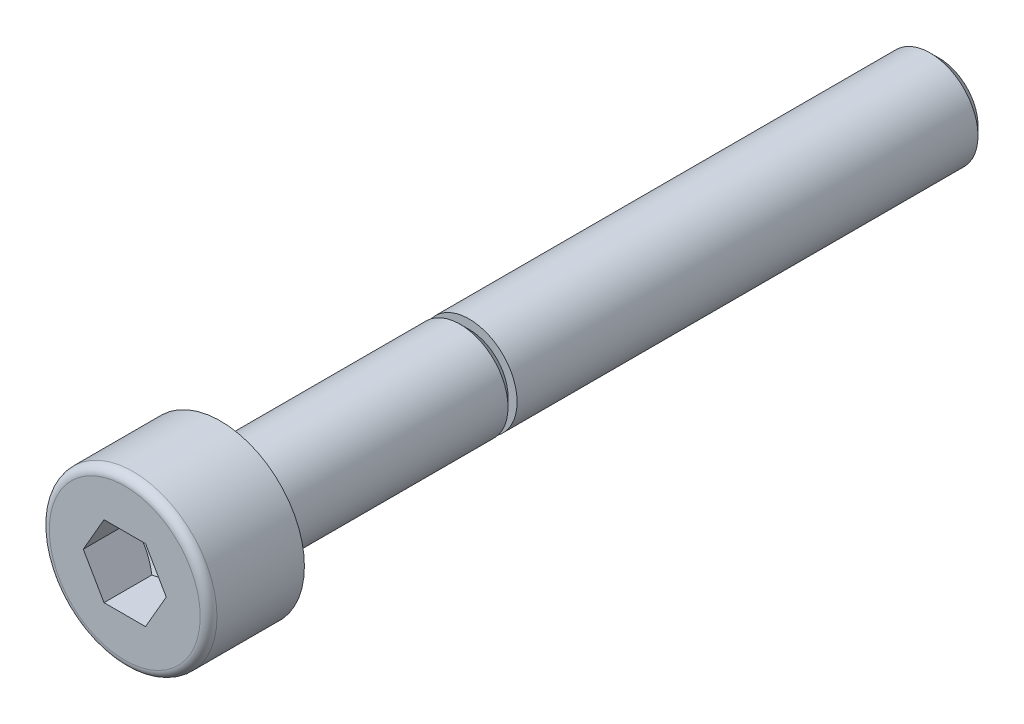
ISO-10303-21;
HEADER;
FILE_DESCRIPTION(('STEP AP214'),'2;1');
FILE_NAME('part.step','',(''),(''),'','','');
FILE_SCHEMA(('AUTOMOTIVE_DESIGN { 1 0 10303 214 1 1 1 1 }'));
ENDSEC;
DATA;
#1=APPLICATION_CONTEXT('core data for automotive mechanical design processes');
#2=APPLICATION_PROTOCOL_DEFINITION('international standard','automotive_design',2000,#1);
#3=PRODUCT_CONTEXT('',#1,'mechanical');
#4=PRODUCT('Part','Part','',(#3));
#5=PRODUCT_RELATED_PRODUCT_CATEGORY('part','',(#4));
#6=PRODUCT_DEFINITION_FORMATION('','',#4);
#7=PRODUCT_DEFINITION_CONTEXT('part definition',#1,'design');
#8=PRODUCT_DEFINITION('design','',#6,#7);
#9=PRODUCT_DEFINITION_SHAPE('','',#8);
#10=(LENGTH_UNIT() NAMED_UNIT(*) SI_UNIT(.MILLI.,.METRE.));
#11=(NAMED_UNIT(*) PLANE_ANGLE_UNIT() SI_UNIT($,.RADIAN.));
#12=(NAMED_UNIT(*) SI_UNIT($,.STERADIAN.) SOLID_ANGLE_UNIT());
#13=UNCERTAINTY_MEASURE_WITH_UNIT(LENGTH_MEASURE(1.E-05),#10,'distance_accuracy_value','');
#14=(GEOMETRIC_REPRESENTATION_CONTEXT(3) GLOBAL_UNCERTAINTY_ASSIGNED_CONTEXT((#13)) GLOBAL_UNIT_ASSIGNED_CONTEXT((#10,
#11,#12)) REPRESENTATION_CONTEXT('',''));
#15=CARTESIAN_POINT('',(0.,0.,0.));
#16=DIRECTION('',(0.,0.,1.));
#17=DIRECTION('',(1.,0.,0.));
#18=AXIS2_PLACEMENT_3D('',#15,#16,#17);
#19=CARTESIAN_POINT('',(0.,0.,4.));
#20=DIRECTION('',(0.,0.,1.));
#21=DIRECTION('',(1.,0.,0.));
#22=AXIS2_PLACEMENT_3D('',#19,#20,#21);
#23=PLANE('',#22);
#24=CARTESIAN_POINT('',(0.,0.,4.));
#25=DIRECTION('',(0.,0.,1.));
#26=DIRECTION('',(1.,0.,0.));
#27=AXIS2_PLACEMENT_3D('',#24,#25,#26);
#28=CIRCLE('',#27,3.15);
#29=CARTESIAN_POINT('',(3.15,0.,4.));
#30=VERTEX_POINT('',#29);
#31=EDGE_CURVE('E118',#30,#30,#28,.T.);
#32=ORIENTED_EDGE('',*,*,#31,.T.);
#33=EDGE_LOOP('',(#32));
#34=FACE_BOUND('',#33,.T.);
#35=DIRECTION('',(1.,0.,0.));
#36=VECTOR('',#35,1.);
#37=CARTESIAN_POINT('',(-0.866025,1.49999930062484,4.));
#38=LINE('',#37,#36);
#39=CARTESIAN_POINT('',(-0.866025,1.49999930062484,4.));
#40=VERTEX_POINT('',#39);
#41=CARTESIAN_POINT('',(0.866025,1.49999930062484,4.));
#42=VERTEX_POINT('',#41);
#43=EDGE_CURVE('E95',#40,#42,#38,.T.);
#44=ORIENTED_EDGE('',*,*,#43,.T.);
#45=DIRECTION('',(0.5,-0.866025403784438,0.));
#46=VECTOR('',#45,1.);
#47=CARTESIAN_POINT('',(0.866025,1.49999930062484,4.));
#48=LINE('',#47,#46);
#49=CARTESIAN_POINT('',(1.73205,0.,4.));
#50=VERTEX_POINT('',#49);
#51=EDGE_CURVE('E32',#42,#50,#48,.T.);
#52=ORIENTED_EDGE('',*,*,#51,.T.);
#53=DIRECTION('',(-0.5,-0.866025403784439,0.));
#54=VECTOR('',#53,1.);
#55=CARTESIAN_POINT('',(1.73205,0.,4.));
#56=LINE('',#55,#54);
#57=CARTESIAN_POINT('',(0.866025,-1.49999930062484,4.));
#58=VERTEX_POINT('',#57);
#59=EDGE_CURVE('E394',#50,#58,#56,.T.);
#60=ORIENTED_EDGE('',*,*,#59,.T.);
#61=DIRECTION('',(-1.,0.,0.));
#62=VECTOR('',#61,1.);
#63=CARTESIAN_POINT('',(0.866025,-1.49999930062484,4.));
#64=LINE('',#63,#62);
#65=CARTESIAN_POINT('',(-0.866025,-1.49999930062484,4.));
#66=VERTEX_POINT('',#65);
#67=EDGE_CURVE('E398',#58,#66,#64,.T.);
#68=ORIENTED_EDGE('',*,*,#67,.T.);
#69=DIRECTION('',(-0.5,0.866025403784439,0.));
#70=VECTOR('',#69,1.);
#71=CARTESIAN_POINT('',(-0.866025,-1.49999930062484,4.));
#72=LINE('',#71,#70);
#73=CARTESIAN_POINT('',(-1.73205,0.,4.));
#74=VERTEX_POINT('',#73);
#75=EDGE_CURVE('E403',#66,#74,#72,.T.);
#76=ORIENTED_EDGE('',*,*,#75,.T.);
#77=DIRECTION('',(0.5,0.866025403784439,0.));
#78=VECTOR('',#77,1.);
#79=CARTESIAN_POINT('',(-1.73205,0.,4.));
#80=LINE('',#79,#78);
#81=EDGE_CURVE('E104',#74,#40,#80,.T.);
#82=ORIENTED_EDGE('',*,*,#81,.T.);
#83=EDGE_LOOP('',(#44,#52,#60,#68,#76,#82));
#84=FACE_BOUND('',#83,.T.);
#85=ADVANCED_FACE('F16',(#34,#84),#23,.T.);
#86=CARTESIAN_POINT('',(0.,1.621125,-30.));
#87=DIRECTION('',(0.,0.,-1.));
#88=DIRECTION('',(-1.,0.,0.));
#89=AXIS2_PLACEMENT_3D('',#86,#87,#88);
#90=PLANE('',#89);
#91=CARTESIAN_POINT('',(0.,0.,-30.));
#92=DIRECTION('',(0.,0.,1.));
#93=DIRECTION('',(1.,0.,0.));
#94=AXIS2_PLACEMENT_3D('',#91,#92,#93);
#95=CIRCLE('',#94,1.621125);
#96=CARTESIAN_POINT('',(1.621125,0.,-30.));
#97=VERTEX_POINT('',#96);
#98=EDGE_CURVE('E11',#97,#97,#95,.T.);
#99=ORIENTED_EDGE('',*,*,#98,.F.);
#100=EDGE_LOOP('',(#99));
#101=FACE_BOUND('',#100,.T.);
#102=ADVANCED_FACE('F18',(#101),#90,.T.);
#103=CARTESIAN_POINT('',(0.,0.,-29.621125));
#104=DIRECTION('',(0.,0.,1.));
#105=DIRECTION('',(1.,0.,0.));
#106=AXIS2_PLACEMENT_3D('',#103,#104,#105);
#107=CONICAL_SURFACE('',#106,2.,0.785398163397448);
#108=ORIENTED_EDGE('',*,*,#98,.T.);
#109=EDGE_LOOP('',(#108));
#110=FACE_BOUND('',#109,.T.);
#111=CARTESIAN_POINT('',(0.,0.,-29.621125));
#112=DIRECTION('',(0.,0.,1.));
#113=DIRECTION('',(1.,0.,0.));
#114=AXIS2_PLACEMENT_3D('',#111,#112,#113);
#115=CIRCLE('',#114,2.);
#116=CARTESIAN_POINT('',(2.,0.,-29.621125));
#117=VERTEX_POINT('',#116);
#118=EDGE_CURVE('E25',#117,#117,#115,.T.);
#119=ORIENTED_EDGE('',*,*,#118,.F.);
#120=EDGE_LOOP('',(#119));
#121=FACE_BOUND('',#120,.T.);
#122=ADVANCED_FACE('F159',(#110,#121),#107,.T.);
#123=CARTESIAN_POINT('',(0.,0.,4.));
#124=DIRECTION('',(0.,0.,1.));
#125=DIRECTION('',(1.,0.,0.));
#126=AXIS2_PLACEMENT_3D('',#123,#124,#125);
#127=CYLINDRICAL_SURFACE('',#126,2.);
#128=ORIENTED_EDGE('',*,*,#118,.T.);
#129=EDGE_LOOP('',(#128));
#130=FACE_BOUND('',#129,.T.);
#131=CARTESIAN_POINT('',(0.,0.,-10.378875));
#132=DIRECTION('',(0.,0.,1.));
#133=DIRECTION('',(1.,0.,0.));
#134=AXIS2_PLACEMENT_3D('',#131,#132,#133);
#135=CIRCLE('',#134,2.);
#136=CARTESIAN_POINT('',(2.,0.,-10.378875));
#137=VERTEX_POINT('',#136);
#138=EDGE_CURVE('E146',#137,#137,#135,.T.);
#139=ORIENTED_EDGE('',*,*,#138,.F.);
#140=EDGE_LOOP('',(#139));
#141=FACE_BOUND('',#140,.T.);
#142=ADVANCED_FACE('F156',(#130,#141),#127,.T.);
#143=CARTESIAN_POINT('',(0.,1.621125,-10.378875));
#144=DIRECTION('',(0.,0.,1.));
#145=DIRECTION('',(1.,0.,0.));
#146=AXIS2_PLACEMENT_3D('',#143,#144,#145);
#147=PLANE('',#146);
#148=ORIENTED_EDGE('',*,*,#138,.T.);
#149=EDGE_LOOP('',(#148));
#150=FACE_BOUND('',#149,.T.);
#151=CARTESIAN_POINT('',(0.,0.,-10.378875));
#152=DIRECTION('',(0.,0.,1.));
#153=DIRECTION('',(1.,0.,0.));
#154=AXIS2_PLACEMENT_3D('',#151,#152,#153);
#155=CIRCLE('',#154,1.621125);
#156=CARTESIAN_POINT('',(1.621125,0.,-10.378875));
#157=VERTEX_POINT('',#156);
#158=EDGE_CURVE('E142',#157,#157,#155,.T.);
#159=ORIENTED_EDGE('',*,*,#158,.F.);
#160=EDGE_LOOP('',(#159));
#161=FACE_BOUND('',#160,.T.);
#162=ADVANCED_FACE('F167',(#150,#161),#147,.T.);
#163=CARTESIAN_POINT('',(0.,0.,-10.));
#164=DIRECTION('',(0.,0.,1.));
#165=DIRECTION('',(1.,0.,0.));
#166=AXIS2_PLACEMENT_3D('',#163,#164,#165);
#167=CONICAL_SURFACE('',#166,2.,0.785398163397448);
#168=ORIENTED_EDGE('',*,*,#158,.T.);
#169=EDGE_LOOP('',(#168));
#170=FACE_BOUND('',#169,.T.);
#171=CARTESIAN_POINT('',(0.,0.,-10.));
#172=DIRECTION('',(0.,0.,1.));
#173=DIRECTION('',(1.,0.,0.));
#174=AXIS2_PLACEMENT_3D('',#171,#172,#173);
#175=CIRCLE('',#174,2.);
#176=CARTESIAN_POINT('',(2.,0.,-10.));
#177=VERTEX_POINT('',#176);
#178=EDGE_CURVE('E138',#177,#177,#175,.T.);
#179=ORIENTED_EDGE('',*,*,#178,.F.);
#180=EDGE_LOOP('',(#179));
#181=FACE_BOUND('',#180,.T.);
#182=ADVANCED_FACE('F199',(#170,#181),#167,.T.);
#183=CARTESIAN_POINT('',(0.,0.,4.));
#184=DIRECTION('',(0.,0.,1.));
#185=DIRECTION('',(1.,0.,0.));
#186=AXIS2_PLACEMENT_3D('',#183,#184,#185);
#187=CYLINDRICAL_SURFACE('',#186,2.);
#188=ORIENTED_EDGE('',*,*,#178,.T.);
#189=EDGE_LOOP('',(#188));
#190=FACE_BOUND('',#189,.T.);
#191=CARTESIAN_POINT('',(0.,0.,-0.2));
#192=DIRECTION('',(0.,0.,1.));
#193=DIRECTION('',(1.,0.,0.));
#194=AXIS2_PLACEMENT_3D('',#191,#192,#193);
#195=CIRCLE('',#194,2.);
#196=CARTESIAN_POINT('',(2.,0.,-0.2));
#197=VERTEX_POINT('',#196);
#198=EDGE_CURVE('E134',#197,#197,#195,.T.);
#199=ORIENTED_EDGE('',*,*,#198,.F.);
#200=EDGE_LOOP('',(#199));
#201=FACE_BOUND('',#200,.T.);
#202=ADVANCED_FACE('F195',(#190,#201),#187,.T.);
#203=CARTESIAN_POINT('',(0.,0.,-0.2));
#204=DIRECTION('',(0.,0.,1.));
#205=DIRECTION('',(1.,0.,0.));
#206=AXIS2_PLACEMENT_3D('',#203,#204,#205);
#207=TOROIDAL_SURFACE('',#206,2.2,0.2);
#208=ORIENTED_EDGE('',*,*,#198,.T.);
#209=EDGE_LOOP('',(#208));
#210=FACE_BOUND('',#209,.T.);
#211=CARTESIAN_POINT('',(0.,0.,0.));
#212=DIRECTION('',(0.,0.,1.));
#213=DIRECTION('',(1.,0.,0.));
#214=AXIS2_PLACEMENT_3D('',#211,#212,#213);
#215=CIRCLE('',#214,2.2);
#216=CARTESIAN_POINT('',(2.2,0.,0.));
#217=VERTEX_POINT('',#216);
#218=EDGE_CURVE('E130',#217,#217,#215,.T.);
#219=ORIENTED_EDGE('',*,*,#218,.F.);
#220=EDGE_LOOP('',(#219));
#221=FACE_BOUND('',#220,.T.);
#222=ADVANCED_FACE('F191',(#210,#221),#207,.F.);
#223=CARTESIAN_POINT('',(0.,3.5,0.));
#224=DIRECTION('',(0.,0.,-1.));
#225=DIRECTION('',(-1.,0.,0.));
#226=AXIS2_PLACEMENT_3D('',#223,#224,#225);
#227=PLANE('',#226);
#228=ORIENTED_EDGE('',*,*,#218,.T.);
#229=EDGE_LOOP('',(#228));
#230=FACE_BOUND('',#229,.T.);
#231=CARTESIAN_POINT('',(0.,0.,0.));
#232=DIRECTION('',(0.,0.,1.));
#233=DIRECTION('',(1.,0.,0.));
#234=AXIS2_PLACEMENT_3D('',#231,#232,#233);
#235=CIRCLE('',#234,3.5);
#236=CARTESIAN_POINT('',(3.5,0.,0.));
#237=VERTEX_POINT('',#236);
#238=EDGE_CURVE('E126',#237,#237,#235,.T.);
#239=ORIENTED_EDGE('',*,*,#238,.F.);
#240=EDGE_LOOP('',(#239));
#241=FACE_BOUND('',#240,.T.);
#242=ADVANCED_FACE('F187',(#230,#241),#227,.T.);
#243=CARTESIAN_POINT('',(0.,0.,4.));
#244=DIRECTION('',(0.,0.,1.));
#245=DIRECTION('',(1.,0.,0.));
#246=AXIS2_PLACEMENT_3D('',#243,#244,#245);
#247=CYLINDRICAL_SURFACE('',#246,3.5);
#248=ORIENTED_EDGE('',*,*,#238,.T.);
#249=EDGE_LOOP('',(#248));
#250=FACE_BOUND('',#249,.T.);
#251=CARTESIAN_POINT('',(0.,0.,3.65));
#252=DIRECTION('',(0.,0.,1.));
#253=DIRECTION('',(1.,0.,0.));
#254=AXIS2_PLACEMENT_3D('',#251,#252,#253);
#255=CIRCLE('',#254,3.5);
#256=CARTESIAN_POINT('',(3.5,0.,3.65));
#257=VERTEX_POINT('',#256);
#258=EDGE_CURVE('E122',#257,#257,#255,.T.);
#259=ORIENTED_EDGE('',*,*,#258,.F.);
#260=EDGE_LOOP('',(#259));
#261=FACE_BOUND('',#260,.T.);
#262=ADVANCED_FACE('F183',(#250,#261),#247,.T.);
#263=CARTESIAN_POINT('',(0.,0.,3.65));
#264=DIRECTION('',(0.,0.,1.));
#265=DIRECTION('',(1.,0.,0.));
#266=AXIS2_PLACEMENT_3D('',#263,#264,#265);
#267=TOROIDAL_SURFACE('',#266,3.15,0.35);
#268=ORIENTED_EDGE('',*,*,#31,.F.);
#269=EDGE_LOOP('',(#268));
#270=FACE_BOUND('',#269,.T.);
#271=ORIENTED_EDGE('',*,*,#258,.T.);
#272=EDGE_LOOP('',(#271));
#273=FACE_BOUND('',#272,.T.);
#274=ADVANCED_FACE('F180',(#270,#273),#267,.T.);
#275=CARTESIAN_POINT('',(0.866025,1.49999930062484,1.00000046625011));
#276=DIRECTION('',(-0.866025403784438,-0.5,0.));
#277=DIRECTION('',(-0.5,0.866025403784438,0.));
#278=AXIS2_PLACEMENT_3D('',#275,#276,#277);
#279=PLANE('',#278);
#280=DIRECTION('',(0.,0.,1.));
#281=VECTOR('',#280,1.);
#282=CARTESIAN_POINT('',(1.73205,0.,1.00000046625011));
#283=LINE('',#282,#281);
#284=CARTESIAN_POINT('',(1.73205,0.,2.));
#285=VERTEX_POINT('',#284);
#286=EDGE_CURVE('E116',#285,#50,#283,.T.);
#287=ORIENTED_EDGE('',*,*,#286,.T.);
#288=ORIENTED_EDGE('',*,*,#51,.F.);
#289=DIRECTION('',(0.,0.,1.));
#290=VECTOR('',#289,1.);
#291=CARTESIAN_POINT('',(0.866025,1.49999930062484,1.00000046625011));
#292=LINE('',#291,#290);
#293=CARTESIAN_POINT('',(0.866025,1.49999930062484,2.));
#294=VERTEX_POINT('',#293);
#295=EDGE_CURVE('E88',#294,#42,#292,.T.);
#296=ORIENTED_EDGE('',*,*,#295,.F.);
#297=CARTESIAN_POINT('',(1.73205115470054,-2.E-06,2.00000066666734));
#298=CARTESIAN_POINT('',(1.69399458130122,0.0659139186895892,1.97802228100261));
#299=CARTESIAN_POINT('',(1.65560950414464,0.132398822577242,1.95803408114054));
#300=CARTESIAN_POINT('',(1.57817473630843,0.266519774741864,1.92314525941874));
#301=CARTESIAN_POINT('',(1.53912367019894,0.334158205333232,1.90825697858766));
#302=CARTESIAN_POINT('',(1.46150547885139,0.468596856338784,1.88508226983918));
#303=CARTESIAN_POINT('',(1.42295029290091,0.535376397300293,1.87664158385231));
#304=CARTESIAN_POINT('',(1.34565859846878,0.669249539059823,1.86656700525616));
#305=CARTESIAN_POINT('',(1.30692237073331,0.736342653591208,1.86492476807133));
#306=CARTESIAN_POINT('',(1.23454773253413,0.861699204131607,1.86834969801067));
#307=CARTESIAN_POINT('',(1.20089846229767,0.919981449818777,1.87257593125167));
#308=CARTESIAN_POINT('',(1.1338191361032,1.03616625092508,1.88596796669928));
#309=CARTESIAN_POINT('',(1.10038931198579,1.09406840478452,1.89513833923059));
#310=CARTESIAN_POINT('',(1.03317179328088,1.21049256234014,1.91806252128818));
#311=CARTESIAN_POINT('',(0.999392601793287,1.26899983823525,1.93191346069662));
#312=CARTESIAN_POINT('',(0.932337893068965,1.38514200063251,1.96334924731355));
#313=CARTESIAN_POINT('',(0.89906151743008,1.4427783739308,1.980926712986));
#314=CARTESIAN_POINT('',(0.866023845299461,1.50000130062484,2.00000066666734));
#315=B_SPLINE_CURVE_WITH_KNOTS('',3,(#297,#298,#299,#300,#301,#302,#303,#304,#305,#306,#307,
#308,#309,#310,#311,#312,#313,#314),.UNSPECIFIED.,.F.,.F.,(4,2,2,2,2,2,2,2,4),(0.,
0.237762055931485,0.476095461361748,0.708530837844131,0.94068083294838,1.14278193102308,
1.34507017093339,1.55184422617205,1.75821246569164),.UNSPECIFIED.);
#316=EDGE_CURVE('E80',#285,#294,#315,.T.);
#317=ORIENTED_EDGE('',*,*,#316,.F.);
#318=EDGE_LOOP('',(#287,#288,#296,#317));
#319=FACE_BOUND('',#318,.T.);
#320=ADVANCED_FACE('F89',(#319),#279,.T.);
#321=CARTESIAN_POINT('',(1.73205,0.,1.00000046625011));
#322=DIRECTION('',(-0.866025403784439,0.5,0.));
#323=DIRECTION('',(0.5,0.866025403784439,0.));
#324=AXIS2_PLACEMENT_3D('',#321,#322,#323);
#325=PLANE('',#324);
#326=DIRECTION('',(0.,0.,1.));
#327=VECTOR('',#326,1.);
#328=CARTESIAN_POINT('',(0.866025,-1.49999930062484,1.00000046625011));
#329=LINE('',#328,#327);
#330=CARTESIAN_POINT('',(0.866025,-1.49999930062484,2.));
#331=VERTEX_POINT('',#330);
#332=EDGE_CURVE('E113',#331,#58,#329,.T.);
#333=ORIENTED_EDGE('',*,*,#332,.T.);
#334=ORIENTED_EDGE('',*,*,#59,.F.);
#335=ORIENTED_EDGE('',*,*,#286,.F.);
#336=CARTESIAN_POINT('',(0.866023845299462,-1.50000130062484,2.00000066666734));
#337=CARTESIAN_POINT('',(0.904080418698778,-1.43408538193525,1.9780222810026));
#338=CARTESIAN_POINT('',(0.942465495855361,-1.36760047804759,1.95803408114054));
#339=CARTESIAN_POINT('',(1.01990026369157,-1.23347952588297,1.92314525941874));
#340=CARTESIAN_POINT('',(1.05895132980106,-1.1658410952916,1.90825697858766));
#341=CARTESIAN_POINT('',(1.13656952114861,-1.03140244428605,1.88508226983918));
#342=CARTESIAN_POINT('',(1.1751247070991,-0.964622903324544,1.87664158385231));
#343=CARTESIAN_POINT('',(1.25241640153122,-0.830749761565014,1.86656700525616));
#344=CARTESIAN_POINT('',(1.29115262926669,-0.763656647033629,1.86492476807133));
#345=CARTESIAN_POINT('',(1.36352726746587,-0.638300096493229,1.86834969801067));
#346=CARTESIAN_POINT('',(1.39717653770233,-0.58001785080606,1.87257593125166));
#347=CARTESIAN_POINT('',(1.4642558638968,-0.463833049699756,1.88596796669928));
#348=CARTESIAN_POINT('',(1.49768568801421,-0.405930895840313,1.89513833923059));
#349=CARTESIAN_POINT('',(1.56490320671912,-0.2895067382847,1.91806252128818));
#350=CARTESIAN_POINT('',(1.59868239820671,-0.230999462389588,1.93191346069662));
#351=CARTESIAN_POINT('',(1.66573710693103,-0.11485729999233,1.96334924731355));
#352=CARTESIAN_POINT('',(1.69901348256992,-0.0572209266940348,1.980926712986));
#353=CARTESIAN_POINT('',(1.73205115470054,1.99999999979098E-06,2.00000066666734));
#354=B_SPLINE_CURVE_WITH_KNOTS('',3,(#336,#337,#338,#339,#340,#341,#342,#343,#344,#345,#346,
#347,#348,#349,#350,#351,#352,#353),.UNSPECIFIED.,.F.,.F.,(4,2,2,2,2,2,2,2,4),(0.,
0.237762055931484,0.476095461361747,0.708530837844129,0.940680832948377,1.14278193102307,
1.34507017093338,1.55184422617205,1.75821246569164),.UNSPECIFIED.);
#355=EDGE_CURVE('E84',#331,#285,#354,.T.);
#356=ORIENTED_EDGE('',*,*,#355,.F.);
#357=EDGE_LOOP('',(#333,#334,#335,#356));
#358=FACE_BOUND('',#357,.T.);
#359=ADVANCED_FACE('F256',(#358),#325,.T.);
#360=CARTESIAN_POINT('',(0.866025,-1.49999930062484,1.00000046625011));
#361=DIRECTION('',(0.,1.,0.));
#362=DIRECTION('',(1.,0.,0.));
#363=AXIS2_PLACEMENT_3D('',#360,#361,#362);
#364=PLANE('',#363);
#365=DIRECTION('',(0.,0.,1.));
#366=VECTOR('',#365,1.);
#367=CARTESIAN_POINT('',(-0.866025,-1.49999930062484,1.00000046625011));
#368=LINE('',#367,#366);
#369=CARTESIAN_POINT('',(-0.866025,-1.49999930062484,2.));
#370=VERTEX_POINT('',#369);
#371=EDGE_CURVE('E110',#370,#66,#368,.T.);
#372=ORIENTED_EDGE('',*,*,#371,.T.);
#373=ORIENTED_EDGE('',*,*,#67,.F.);
#374=ORIENTED_EDGE('',*,*,#332,.F.);
#375=CARTESIAN_POINT('',(-2.24271663728987,-1.49999930062484,2.55775267344395));
#376=CARTESIAN_POINT('',(-2.17794141332338,-1.49999930062484,2.52667596135368));
#377=CARTESIAN_POINT('',(-2.11300852130655,-1.49999930062484,2.49592211621229));
#378=CARTESIAN_POINT('',(-1.98274303131292,-1.49999930062484,2.43524311162405));
#379=CARTESIAN_POINT('',(-1.91741036395219,-1.49999930062484,2.40531810131238));
#380=CARTESIAN_POINT('',(-1.78588635397686,-1.49999930062484,2.34631254095844));
#381=CARTESIAN_POINT('',(-1.71969220663993,-1.49999930062484,2.31723821458641));
#382=CARTESIAN_POINT('',(-1.58674953026847,-1.49999930062484,2.26039396688304));
#383=CARTESIAN_POINT('',(-1.52000103027226,-1.49999930062484,2.23262397772829));
#384=CARTESIAN_POINT('',(-1.38408036083489,-1.49999930062484,2.17802545642731));
#385=CARTESIAN_POINT('',(-1.31489044686774,-1.49999930062484,2.1512405113674));
#386=CARTESIAN_POINT('',(-1.17568875836751,-1.49999930062484,2.09990652822181));
#387=CARTESIAN_POINT('',(-1.10567688208708,-1.49999930062484,2.07535777031023));
#388=CARTESIAN_POINT('',(-0.894522216300188,-1.49999930062484,2.0061010834001));
#389=CARTESIAN_POINT('',(-0.751873977094198,-1.49999930062484,1.9656202744164));
#390=CARTESIAN_POINT('',(-0.535047450977606,-1.49999930062484,1.9186645261203));
#391=CARTESIAN_POINT('',(-0.462365424606466,-1.49999930062484,1.90531291688069));
#392=CARTESIAN_POINT('',(-0.316183762847225,-1.49999930062484,1.8841134767258));
#393=CARTESIAN_POINT('',(-0.242684183051902,-1.49999930062484,1.87626527388084));
#394=CARTESIAN_POINT('',(-0.0961588910059515,-1.49999930062484,1.86679859934064));
#395=CARTESIAN_POINT('',(-0.0231380525234333,-1.49999930062484,1.86510661239957));
#396=CARTESIAN_POINT('',(0.122783022434076,-1.49999930062484,1.86789948707645));
#397=CARTESIAN_POINT('',(0.195683251161583,-1.49999930062484,1.8723847311637));
#398=CARTESIAN_POINT('',(0.375553746438775,-1.49999930062484,1.89067768491976));
#399=CARTESIAN_POINT('',(0.4821754471692,-1.49999930062484,1.90791354190592));
#400=CARTESIAN_POINT('',(0.693345462539466,-1.49999930062484,1.95235984396466));
#401=CARTESIAN_POINT('',(0.79789111749796,-1.49999930062484,1.97958231080908));
#402=CARTESIAN_POINT('',(0.954250638010105,-1.49999930062484,2.02608493590371));
#403=CARTESIAN_POINT('',(1.00687274480645,-1.49999930062484,2.04274751774646));
#404=CARTESIAN_POINT('',(1.11156919647057,-1.49999930062484,2.07761406562061));
#405=CARTESIAN_POINT('',(1.16364386068557,-1.49999930062484,2.09581706970924));
#406=CARTESIAN_POINT('',(1.26731501755411,-1.49999930062484,2.13350010092581));
#407=CARTESIAN_POINT('',(1.31891159517315,-1.49999930062484,2.15297989597396));
#408=CARTESIAN_POINT('',(1.42169818698628,-1.49999930062484,2.19300580386973));
#409=CARTESIAN_POINT('',(1.47288813079445,-1.49999930062484,2.21355209687612));
#410=CARTESIAN_POINT('',(1.6035520536722,-1.49999930062484,2.26731329701247));
#411=CARTESIAN_POINT('',(1.68276476914258,-1.49999930062484,2.30116251352867));
#412=CARTESIAN_POINT('',(1.84047488481565,-1.49999930062484,2.37049266735));
#413=CARTESIAN_POINT('',(1.9189722309026,-1.49999930062484,2.40597372689195));
#414=CARTESIAN_POINT('',(2.15362957255391,-1.49999930062484,2.51428942992019));
#415=CARTESIAN_POINT('',(2.3089286607519,-1.49999930062484,2.58898549353906));
#416=CARTESIAN_POINT('',(2.61820006623532,-1.49999930062484,2.74151036059574));
#417=CARTESIAN_POINT('',(2.77217051778771,-1.49999930062484,2.81934290231597));
#418=CARTESIAN_POINT('',(3.07905650209162,-1.49999930062484,2.97700931547993));
#419=CARTESIAN_POINT('',(3.23197216581148,-1.49999930062484,3.05684293253984));
#420=CARTESIAN_POINT('',(3.52267476728495,-1.49999930062484,3.21028853935711));
#421=CARTESIAN_POINT('',(3.66052737206612,-1.49999930062484,3.28377655462836));
#422=CARTESIAN_POINT('',(3.93578914881928,-1.49999930062484,3.43158990958268));
#423=CARTESIAN_POINT('',(4.07319830413762,-1.49999930062484,3.50591528025237));
#424=CARTESIAN_POINT('',(4.34732590427536,-1.49999930062483,3.65500351537988));
#425=CARTESIAN_POINT('',(4.48404521696312,-1.49999930062483,3.72976478622522));
#426=CARTESIAN_POINT('',(4.75720742747683,-1.49999930062483,3.87977391809883));
#427=CARTESIAN_POINT('',(4.89365033939364,-1.49999930062484,3.9550217534582));
#428=CARTESIAN_POINT('',(5.02999394665514,-1.49999930062484,4.03044801324502));
#429=B_SPLINE_CURVE_WITH_KNOTS('',3,(#375,#376,#377,#378,#379,#380,#381,#382,#383,#384,#385,
#386,#387,#388,#389,#390,#391,#392,#393,#394,#395,#396,#397,#398,#399,#400,#401,#402,#403,#404,
#405,#406,#407,#408,#409,#410,#411,#412,#413,#414,#415,#416,#417,#418,#419,#420,#421,#422,#423,
#424,#425,#426,#427,#428),.UNSPECIFIED.,.F.,.F.,(4,2,2,2,2,2,2,2,2,2,2,2,2,2,2,2,2,2,2,2,2,2,2,
2,2,2,4),(0.,0.215535408976475,0.431109351318747,0.647990972858705,0.864861304394723,
1.08740082372431,1.30996818700982,1.75384735851117,1.97537373294937,2.19688513480997,
2.41574248382684,2.63461338422016,2.95796620171825,3.28170955197757,3.44728283297626,
3.61275347131505,3.77819411534645,3.94366279806486,4.20206179692704,4.46048018336434,
4.97740230798824,5.49495989978084,6.01245202818902,6.48110050133562,6.94976637432356,
7.41724019162004,7.88468954517039),.UNSPECIFIED.);
#430=EDGE_CURVE('E440',#370,#331,#429,.T.);
#431=ORIENTED_EDGE('',*,*,#430,.F.);
#432=EDGE_LOOP('',(#372,#373,#374,#431));
#433=FACE_BOUND('',#432,.T.);
#434=ADVANCED_FACE('F262',(#433),#364,.T.);
#435=CARTESIAN_POINT('',(-0.866025,-1.49999930062484,1.00000046625011));
#436=DIRECTION('',(0.866025403784439,0.5,0.));
#437=DIRECTION('',(0.5,-0.866025403784439,0.));
#438=AXIS2_PLACEMENT_3D('',#435,#436,#437);
#439=PLANE('',#438);
#440=DIRECTION('',(0.,0.,1.));
#441=VECTOR('',#440,1.);
#442=CARTESIAN_POINT('',(-1.73205,0.,1.00000046625011));
#443=LINE('',#442,#441);
#444=CARTESIAN_POINT('',(-1.73205,0.,2.));
#445=VERTEX_POINT('',#444);
#446=EDGE_CURVE('E101',#445,#74,#443,.T.);
#447=ORIENTED_EDGE('',*,*,#446,.T.);
#448=ORIENTED_EDGE('',*,*,#75,.F.);
#449=ORIENTED_EDGE('',*,*,#371,.F.);
#450=CARTESIAN_POINT('',(-1.73205115470054,1.99999999935948E-06,2.00000066666734));
#451=CARTESIAN_POINT('',(-1.69399458130122,-0.0659139186895897,1.97802228100261));
#452=CARTESIAN_POINT('',(-1.65560950414464,-0.132398822577242,1.95803408114054));
#453=CARTESIAN_POINT('',(-1.57817473630843,-0.266519774741865,1.92314525941874));
#454=CARTESIAN_POINT('',(-1.53912367019894,-0.334158205333233,1.90825697858766));
#455=CARTESIAN_POINT('',(-1.46150547885139,-0.468596856338785,1.88508226983918));
#456=CARTESIAN_POINT('',(-1.4229502929009,-0.535376397300293,1.87664158385231));
#457=CARTESIAN_POINT('',(-1.34565859846878,-0.669249539059823,1.86656700525616));
#458=CARTESIAN_POINT('',(-1.30692237073331,-0.736342653591209,1.86492476807133));
#459=CARTESIAN_POINT('',(-1.23454773253413,-0.861699204131608,1.86834969801067));
#460=CARTESIAN_POINT('',(-1.20089846229767,-0.919981449818777,1.87257593125166));
#461=CARTESIAN_POINT('',(-1.1338191361032,-1.03616625092508,1.88596796669928));
#462=CARTESIAN_POINT('',(-1.10038931198579,-1.09406840478452,1.89513833923059));
#463=CARTESIAN_POINT('',(-1.03317179328088,-1.21049256234014,1.91806252128818));
#464=CARTESIAN_POINT('',(-0.999392601793289,-1.26899983823525,1.93191346069662));
#465=CARTESIAN_POINT('',(-0.932337893068967,-1.38514200063251,1.96334924731355));
#466=CARTESIAN_POINT('',(-0.899061517430081,-1.4427783739308,1.980926712986));
#467=CARTESIAN_POINT('',(-0.866023845299461,-1.50000130062484,2.00000066666734));
#468=B_SPLINE_CURVE_WITH_KNOTS('',3,(#450,#451,#452,#453,#454,#455,#456,#457,#458,#459,#460,
#461,#462,#463,#464,#465,#466,#467),.UNSPECIFIED.,.F.,.F.,(4,2,2,2,2,2,2,2,4),(0.,
0.237762055931485,0.476095461361749,0.708530837844132,0.94068083294838,1.14278193102308,
1.34507017093338,1.55184422617205,1.75821246569164),.UNSPECIFIED.);
#469=EDGE_CURVE('E436',#445,#370,#468,.T.);
#470=ORIENTED_EDGE('',*,*,#469,.F.);
#471=EDGE_LOOP('',(#447,#448,#449,#470));
#472=FACE_BOUND('',#471,.T.);
#473=ADVANCED_FACE('F269',(#472),#439,.T.);
#474=CARTESIAN_POINT('',(-1.73205,0.,1.00000046625011));
#475=DIRECTION('',(0.866025403784439,-0.5,0.));
#476=DIRECTION('',(-0.5,-0.866025403784439,0.));
#477=AXIS2_PLACEMENT_3D('',#474,#475,#476);
#478=PLANE('',#477);
#479=DIRECTION('',(0.,0.,1.));
#480=VECTOR('',#479,1.);
#481=CARTESIAN_POINT('',(-0.866025,1.49999930062484,1.00000046625011));
#482=LINE('',#481,#480);
#483=CARTESIAN_POINT('',(-0.866025,1.49999930062484,2.));
#484=VERTEX_POINT('',#483);
#485=EDGE_CURVE('E94',#484,#40,#482,.T.);
#486=ORIENTED_EDGE('',*,*,#485,.T.);
#487=ORIENTED_EDGE('',*,*,#81,.F.);
#488=ORIENTED_EDGE('',*,*,#446,.F.);
#489=CARTESIAN_POINT('',(-0.866023845299462,1.50000130062484,2.00000066666734));
#490=CARTESIAN_POINT('',(-0.904080418698778,1.43408538193525,1.9780222810026));
#491=CARTESIAN_POINT('',(-0.942465495855361,1.36760047804759,1.95803408114054));
#492=CARTESIAN_POINT('',(-1.01990026369157,1.23347952588297,1.92314525941874));
#493=CARTESIAN_POINT('',(-1.05895132980106,1.1658410952916,1.90825697858766));
#494=CARTESIAN_POINT('',(-1.13656952114861,1.03140244428605,1.88508226983918));
#495=CARTESIAN_POINT('',(-1.1751247070991,0.964622903324544,1.87664158385231));
#496=CARTESIAN_POINT('',(-1.25241640153122,0.830749761565014,1.86656700525616));
#497=CARTESIAN_POINT('',(-1.29115262926669,0.763656647033629,1.86492476807133));
#498=CARTESIAN_POINT('',(-1.36352726746587,0.638300096493229,1.86834969801067));
#499=CARTESIAN_POINT('',(-1.39717653770233,0.58001785080606,1.87257593125166));
#500=CARTESIAN_POINT('',(-1.4642558638968,0.463833049699756,1.88596796669928));
#501=CARTESIAN_POINT('',(-1.49768568801421,0.405930895840313,1.89513833923059));
#502=CARTESIAN_POINT('',(-1.56490320671912,0.289506738284699,1.91806252128818));
#503=CARTESIAN_POINT('',(-1.59868239820671,0.230999462389588,1.93191346069662));
#504=CARTESIAN_POINT('',(-1.66573710693103,0.11485729999233,1.96334924731355));
#505=CARTESIAN_POINT('',(-1.69901348256992,0.0572209266940344,1.980926712986));
#506=CARTESIAN_POINT('',(-1.73205115470054,-2.00000000048508E-06,2.00000066666734));
#507=B_SPLINE_CURVE_WITH_KNOTS('',3,(#489,#490,#491,#492,#493,#494,#495,#496,#497,#498,#499,
#500,#501,#502,#503,#504,#505,#506),.UNSPECIFIED.,.F.,.F.,(4,2,2,2,2,2,2,2,4),(0.,
0.237762055931484,0.476095461361747,0.708530837844129,0.940680832948377,1.14278193102307,
1.34507017093338,1.55184422617205,1.75821246569164),.UNSPECIFIED.);
#508=EDGE_CURVE('E40',#484,#445,#507,.T.);
#509=ORIENTED_EDGE('',*,*,#508,.F.);
#510=EDGE_LOOP('',(#486,#487,#488,#509));
#511=FACE_BOUND('',#510,.T.);
#512=ADVANCED_FACE('F277',(#511),#478,.T.);
#513=CARTESIAN_POINT('',(-0.866025,1.49999930062484,1.00000046625011));
#514=DIRECTION('',(0.,-1.,0.));
#515=DIRECTION('',(-1.,0.,0.));
#516=AXIS2_PLACEMENT_3D('',#513,#514,#515);
#517=PLANE('',#516);
#518=ORIENTED_EDGE('',*,*,#295,.T.);
#519=ORIENTED_EDGE('',*,*,#43,.F.);
#520=ORIENTED_EDGE('',*,*,#485,.F.);
#521=CARTESIAN_POINT('',(-2.24271663728987,1.49999930062484,2.55775267344395));
#522=CARTESIAN_POINT('',(-2.17794141332338,1.49999930062484,2.52667596135368));
#523=CARTESIAN_POINT('',(-2.11300852130655,1.49999930062484,2.49592211621229));
#524=CARTESIAN_POINT('',(-1.98274303131292,1.49999930062484,2.43524311162405));
#525=CARTESIAN_POINT('',(-1.91741036395219,1.49999930062484,2.40531810131238));
#526=CARTESIAN_POINT('',(-1.78588635397687,1.49999930062484,2.34631254095844));
#527=CARTESIAN_POINT('',(-1.71969220663993,1.49999930062484,2.31723821458641));
#528=CARTESIAN_POINT('',(-1.58674953026847,1.49999930062484,2.26039396688304));
#529=CARTESIAN_POINT('',(-1.52000103027226,1.49999930062484,2.23262397772829));
#530=CARTESIAN_POINT('',(-1.3840803608349,1.49999930062484,2.17802545642731));
#531=CARTESIAN_POINT('',(-1.31489044686775,1.49999930062484,2.1512405113674));
#532=CARTESIAN_POINT('',(-1.17568875836751,1.49999930062484,2.09990652822181));
#533=CARTESIAN_POINT('',(-1.10567688208708,1.49999930062484,2.07535777031023));
#534=CARTESIAN_POINT('',(-0.894522216300189,1.49999930062484,2.0061010834001));
#535=CARTESIAN_POINT('',(-0.751873977094199,1.49999930062484,1.9656202744164));
#536=CARTESIAN_POINT('',(-0.535047450977607,1.49999930062484,1.9186645261203));
#537=CARTESIAN_POINT('',(-0.462365424606467,1.49999930062484,1.90531291688069));
#538=CARTESIAN_POINT('',(-0.316183762847226,1.49999930062484,1.8841134767258));
#539=CARTESIAN_POINT('',(-0.242684183051903,1.49999930062484,1.87626527388084));
#540=CARTESIAN_POINT('',(-0.0961588910059524,1.49999930062484,1.86679859934064));
#541=CARTESIAN_POINT('',(-0.0231380525234342,1.49999930062484,1.86510661239957));
#542=CARTESIAN_POINT('',(0.122783022434075,1.49999930062484,1.86789948707645));
#543=CARTESIAN_POINT('',(0.195683251161582,1.49999930062484,1.8723847311637));
#544=CARTESIAN_POINT('',(0.375553746438774,1.49999930062484,1.89067768491976));
#545=CARTESIAN_POINT('',(0.482175447169199,1.49999930062484,1.90791354190592));
#546=CARTESIAN_POINT('',(0.693345462539464,1.49999930062484,1.95235984396466));
#547=CARTESIAN_POINT('',(0.797891117497957,1.49999930062484,1.97958231080908));
#548=CARTESIAN_POINT('',(0.954250638010102,1.49999930062484,2.02608493590371));
#549=CARTESIAN_POINT('',(1.00687274480645,1.49999930062484,2.04274751774646));
#550=CARTESIAN_POINT('',(1.11156919647056,1.49999930062484,2.07761406562061));
#551=CARTESIAN_POINT('',(1.16364386068556,1.49999930062484,2.09581706970924));
#552=CARTESIAN_POINT('',(1.2673150175541,1.49999930062484,2.13350010092581));
#553=CARTESIAN_POINT('',(1.31891159517315,1.49999930062484,2.15297989597396));
#554=CARTESIAN_POINT('',(1.42169818698628,1.49999930062484,2.19300580386972));
#555=CARTESIAN_POINT('',(1.47288813079445,1.49999930062484,2.21355209687612));
#556=CARTESIAN_POINT('',(1.60355205367219,1.49999930062484,2.26731329701247));
#557=CARTESIAN_POINT('',(1.68276476914257,1.49999930062484,2.30116251352867));
#558=CARTESIAN_POINT('',(1.84047488481565,1.49999930062484,2.37049266735));
#559=CARTESIAN_POINT('',(1.91897223090259,1.49999930062484,2.40597372689195));
#560=CARTESIAN_POINT('',(2.15362957255391,1.49999930062484,2.51428942992019));
#561=CARTESIAN_POINT('',(2.30892866075189,1.49999930062484,2.58898549353906));
#562=CARTESIAN_POINT('',(2.61820006623532,1.49999930062484,2.74151036059574));
#563=CARTESIAN_POINT('',(2.77217051778771,1.49999930062484,2.81934290231597));
#564=CARTESIAN_POINT('',(3.07905650209162,1.49999930062484,2.97700931547993));
#565=CARTESIAN_POINT('',(3.23197216581148,1.49999930062484,3.05684293253984));
#566=CARTESIAN_POINT('',(3.52267476728495,1.49999930062484,3.21028853935711));
#567=CARTESIAN_POINT('',(3.66052737206611,1.49999930062484,3.28377655462836));
#568=CARTESIAN_POINT('',(3.93578914881928,1.49999930062484,3.43158990958268));
#569=CARTESIAN_POINT('',(4.07319830413762,1.49999930062484,3.50591528025237));
#570=CARTESIAN_POINT('',(4.34732590427536,1.49999930062484,3.65500351537988));
#571=CARTESIAN_POINT('',(4.48404521696312,1.49999930062484,3.72976478622523));
#572=CARTESIAN_POINT('',(4.75720742747683,1.49999930062484,3.87977391809883));
#573=CARTESIAN_POINT('',(4.89365033939364,1.49999930062484,3.9550217534582));
#574=CARTESIAN_POINT('',(5.02999394665514,1.49999930062484,4.03044801324502));
#575=B_SPLINE_CURVE_WITH_KNOTS('',3,(#521,#522,#523,#524,#525,#526,#527,#528,#529,#530,#531,
#532,#533,#534,#535,#536,#537,#538,#539,#540,#541,#542,#543,#544,#545,#546,#547,#548,#549,#550,
#551,#552,#553,#554,#555,#556,#557,#558,#559,#560,#561,#562,#563,#564,#565,#566,#567,#568,#569,
#570,#571,#572,#573,#574),.UNSPECIFIED.,.F.,.F.,(4,2,2,2,2,2,2,2,2,2,2,2,2,2,2,2,2,2,2,2,2,2,2,
2,2,2,4),(0.,0.215535408976474,0.431109351318746,0.647990972858704,0.864861304394721,
1.0874008237243,1.30996818700982,1.75384735851117,1.97537373294937,2.19688513480997,
2.41574248382684,2.63461338422015,2.95796620171825,3.28170955197757,3.44728283297626,
3.61275347131505,3.77819411534645,3.94366279806485,4.20206179692704,4.46048018336433,
4.97740230798824,5.49495989978084,6.01245202818902,6.48110050133561,6.94976637432355,
7.41724019162004,7.88468954517039),.UNSPECIFIED.);
#576=EDGE_CURVE('E81',#294,#484,#575,.F.);
#577=ORIENTED_EDGE('',*,*,#576,.F.);
#578=EDGE_LOOP('',(#518,#519,#520,#577));
#579=FACE_BOUND('',#578,.T.);
#580=ADVANCED_FACE('F76',(#579),#517,.T.);
#581=CARTESIAN_POINT('',(0.,0.,1.00000046625011));
#582=DIRECTION('',(0.,0.,1.));
#583=DIRECTION('',(1.,0.,0.));
#584=AXIS2_PLACEMENT_3D('',#581,#582,#583);
#585=CONICAL_SURFACE('',#584,0.,1.0471975511966);
#586=CARTESIAN_POINT('',(0.,0.,1.00000046625011));
#587=VERTEX_POINT('',#586);
#588=VERTEX_LOOP('',#587);
#589=FACE_BOUND('',#588,.T.);
#590=ORIENTED_EDGE('',*,*,#316,.T.);
#591=ORIENTED_EDGE('',*,*,#576,.T.);
#592=ORIENTED_EDGE('',*,*,#508,.T.);
#593=ORIENTED_EDGE('',*,*,#469,.T.);
#594=ORIENTED_EDGE('',*,*,#430,.T.);
#595=ORIENTED_EDGE('',*,*,#355,.T.);
#596=EDGE_LOOP('',(#590,#591,#592,#593,#594,#595));
#597=FACE_BOUND('',#596,.T.);
#598=ADVANCED_FACE('F73',(#589,#597),#585,.F.);
#599=CLOSED_SHELL('',(#85,#102,#122,#142,#162,#182,#202,#222,#242,#262,#274,#320,#359,#434,#473,
#512,#580,#598));
#600=MANIFOLD_SOLID_BREP('B1',#599);
#601=ADVANCED_BREP_SHAPE_REPRESENTATION('',(#18,#600),#14);
#602=SHAPE_DEFINITION_REPRESENTATION(#9,#601);
ENDSEC;
END-ISO-10303-21;
